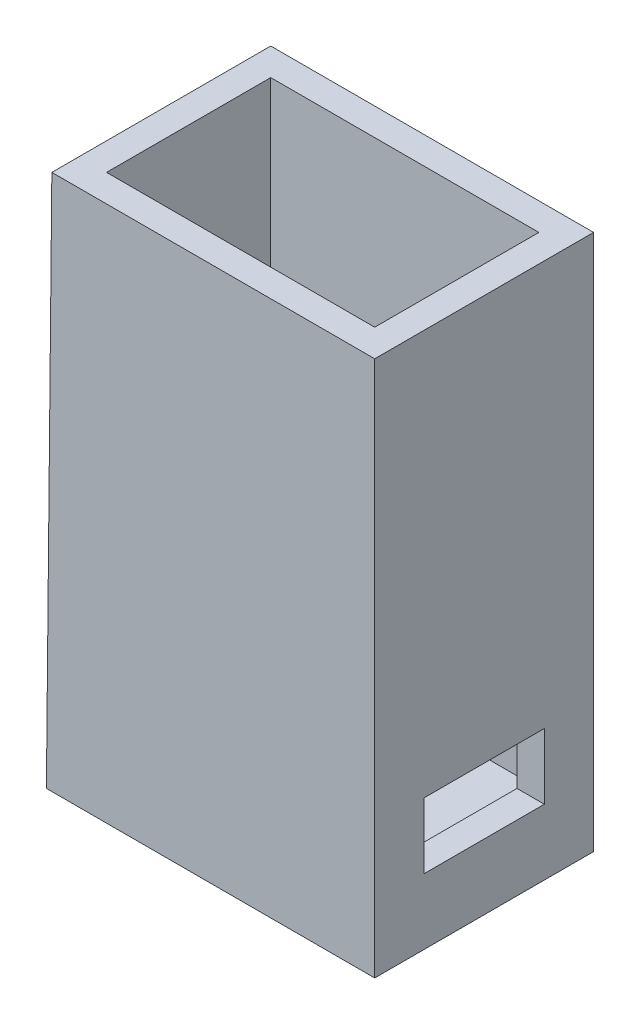
ISO-10303-21;
HEADER;
FILE_DESCRIPTION(('STEP AP214'),'2;1');
FILE_NAME('part.step','',(''),(''),'','','');
FILE_SCHEMA(('AUTOMOTIVE_DESIGN { 1 0 10303 214 1 1 1 1 }'));
ENDSEC;
DATA;
#1=APPLICATION_CONTEXT('core data for automotive mechanical design processes');
#2=APPLICATION_PROTOCOL_DEFINITION('international standard','automotive_design',2000,#1);
#3=PRODUCT_CONTEXT('',#1,'mechanical');
#4=PRODUCT('Part','Part','',(#3));
#5=PRODUCT_RELATED_PRODUCT_CATEGORY('part','',(#4));
#6=PRODUCT_DEFINITION_FORMATION('','',#4);
#7=PRODUCT_DEFINITION_CONTEXT('part definition',#1,'design');
#8=PRODUCT_DEFINITION('design','',#6,#7);
#9=PRODUCT_DEFINITION_SHAPE('','',#8);
#10=(LENGTH_UNIT() NAMED_UNIT(*) SI_UNIT(.MILLI.,.METRE.));
#11=(NAMED_UNIT(*) PLANE_ANGLE_UNIT() SI_UNIT($,.RADIAN.));
#12=(NAMED_UNIT(*) SI_UNIT($,.STERADIAN.) SOLID_ANGLE_UNIT());
#13=UNCERTAINTY_MEASURE_WITH_UNIT(LENGTH_MEASURE(1.E-05),#10,'distance_accuracy_value','');
#14=(GEOMETRIC_REPRESENTATION_CONTEXT(3) GLOBAL_UNCERTAINTY_ASSIGNED_CONTEXT((#13)) GLOBAL_UNIT_ASSIGNED_CONTEXT((#10,
#11,#12)) REPRESENTATION_CONTEXT('',''));
#15=CARTESIAN_POINT('',(0.,0.,0.));
#16=DIRECTION('',(0.,0.,1.));
#17=DIRECTION('',(1.,0.,0.));
#18=AXIS2_PLACEMENT_3D('',#15,#16,#17);
#19=CARTESIAN_POINT('',(34.925,6.34999999999999,25.4));
#20=DIRECTION('',(-1.,0.,0.));
#21=DIRECTION('',(0.,0.,1.));
#22=AXIS2_PLACEMENT_3D('',#19,#20,#21);
#23=PLANE('',#22);
#24=DIRECTION('',(0.,1.,0.));
#25=VECTOR('',#24,1.);
#26=CARTESIAN_POINT('',(34.925,6.34999999999999,19.685));
#27=LINE('',#26,#25);
#28=CARTESIAN_POINT('',(34.925,7.62,19.685));
#29=VERTEX_POINT('',#28);
#30=CARTESIAN_POINT('',(34.925,15.24,19.685));
#31=VERTEX_POINT('',#30);
#32=EDGE_CURVE('E258',#29,#31,#27,.T.);
#33=ORIENTED_EDGE('',*,*,#32,.F.);
#34=DIRECTION('',(0.,0.,1.));
#35=VECTOR('',#34,1.);
#36=CARTESIAN_POINT('',(34.925,7.62,25.4));
#37=LINE('',#36,#35);
#38=CARTESIAN_POINT('',(34.925,7.62,5.715));
#39=VERTEX_POINT('',#38);
#40=EDGE_CURVE('E232',#39,#29,#37,.T.);
#41=ORIENTED_EDGE('',*,*,#40,.F.);
#42=DIRECTION('',(0.,1.,0.));
#43=VECTOR('',#42,1.);
#44=CARTESIAN_POINT('',(34.925,6.35,5.71499999999999));
#45=LINE('',#44,#43);
#46=CARTESIAN_POINT('',(34.925,15.24,5.715));
#47=VERTEX_POINT('',#46);
#48=EDGE_CURVE('E238',#39,#47,#45,.T.);
#49=ORIENTED_EDGE('',*,*,#48,.T.);
#50=DIRECTION('',(0.,0.,1.));
#51=VECTOR('',#50,1.);
#52=CARTESIAN_POINT('',(34.925,15.24,25.4));
#53=LINE('',#52,#51);
#54=EDGE_CURVE('E247',#47,#31,#53,.T.);
#55=ORIENTED_EDGE('',*,*,#54,.T.);
#56=EDGE_LOOP('',(#33,#41,#49,#55));
#57=FACE_BOUND('',#56,.T.);
#58=DIRECTION('',(0.,0.,-1.));
#59=VECTOR('',#58,1.);
#60=CARTESIAN_POINT('',(34.925,62.23,25.4));
#61=LINE('',#60,#59);
#62=CARTESIAN_POINT('',(34.925,62.23,22.225));
#63=VERTEX_POINT('',#62);
#64=CARTESIAN_POINT('',(34.925,62.23,3.175));
#65=VERTEX_POINT('',#64);
#66=EDGE_CURVE('E296',#63,#65,#61,.T.);
#67=ORIENTED_EDGE('',*,*,#66,.T.);
#68=DIRECTION('',(0.,-1.,0.));
#69=VECTOR('',#68,1.);
#70=CARTESIAN_POINT('',(34.925,62.23,3.175));
#71=LINE('',#70,#69);
#72=CARTESIAN_POINT('',(34.925,6.34999999999999,3.175));
#73=VERTEX_POINT('',#72);
#74=EDGE_CURVE('E63',#65,#73,#71,.T.);
#75=ORIENTED_EDGE('',*,*,#74,.T.);
#76=DIRECTION('',(0.,0.,-1.));
#77=VECTOR('',#76,1.);
#78=CARTESIAN_POINT('',(34.925,6.34999999999999,25.4));
#79=LINE('',#78,#77);
#80=CARTESIAN_POINT('',(34.925,6.34999999999999,22.225));
#81=VERTEX_POINT('',#80);
#82=EDGE_CURVE('E168',#81,#73,#79,.T.);
#83=ORIENTED_EDGE('',*,*,#82,.F.);
#84=DIRECTION('',(0.,-1.,0.));
#85=VECTOR('',#84,1.);
#86=CARTESIAN_POINT('',(34.925,62.23,22.225));
#87=LINE('',#86,#85);
#88=EDGE_CURVE('E194',#63,#81,#87,.T.);
#89=ORIENTED_EDGE('',*,*,#88,.F.);
#90=EDGE_LOOP('',(#67,#75,#83,#89));
#91=FACE_BOUND('',#90,.T.);
#92=ADVANCED_FACE('F44',(#57,#91),#23,.T.);
#93=CARTESIAN_POINT('',(3.80714408322846,62.23,25.4));
#94=DIRECTION('',(1.,0.,0.));
#95=DIRECTION('',(0.,1.,0.));
#96=AXIS2_PLACEMENT_3D('',#93,#94,#95);
#97=PLANE('',#96);
#98=DIRECTION('',(0.,-1.,0.));
#99=VECTOR('',#98,1.);
#100=CARTESIAN_POINT('',(3.80714408322847,62.23,3.175));
#101=LINE('',#100,#99);
#102=CARTESIAN_POINT('',(3.80714408322846,62.23,3.175));
#103=VERTEX_POINT('',#102);
#104=CARTESIAN_POINT('',(3.80714408322847,6.34999999999999,3.175));
#105=VERTEX_POINT('',#104);
#106=EDGE_CURVE('E164',#103,#105,#101,.T.);
#107=ORIENTED_EDGE('',*,*,#106,.F.);
#108=DIRECTION('',(0.,0.,-1.));
#109=VECTOR('',#108,1.);
#110=CARTESIAN_POINT('',(3.80714408322846,62.23,25.4));
#111=LINE('',#110,#109);
#112=CARTESIAN_POINT('',(3.80714408322847,62.23,22.225));
#113=VERTEX_POINT('',#112);
#114=EDGE_CURVE('E173',#113,#103,#111,.T.);
#115=ORIENTED_EDGE('',*,*,#114,.F.);
#116=DIRECTION('',(0.,-1.,0.));
#117=VECTOR('',#116,1.);
#118=CARTESIAN_POINT('',(3.80714408322847,62.23,22.225));
#119=LINE('',#118,#117);
#120=CARTESIAN_POINT('',(3.80714408322847,6.34999999999999,22.225));
#121=VERTEX_POINT('',#120);
#122=EDGE_CURVE('E170',#113,#121,#119,.T.);
#123=ORIENTED_EDGE('',*,*,#122,.T.);
#124=DIRECTION('',(0.,0.,-1.));
#125=VECTOR('',#124,1.);
#126=CARTESIAN_POINT('',(3.80714408322847,6.34999999999999,25.4));
#127=LINE('',#126,#125);
#128=EDGE_CURVE('E157',#121,#105,#127,.T.);
#129=ORIENTED_EDGE('',*,*,#128,.T.);
#130=EDGE_LOOP('',(#107,#115,#123,#129));
#131=FACE_BOUND('',#130,.T.);
#132=DIRECTION('',(0.,-1.,0.));
#133=VECTOR('',#132,1.);
#134=CARTESIAN_POINT('',(3.80714408322846,62.23,19.685));
#135=LINE('',#134,#133);
#136=CARTESIAN_POINT('',(3.80714408322847,15.24,19.685));
#137=VERTEX_POINT('',#136);
#138=CARTESIAN_POINT('',(3.80714408322847,7.62,19.685));
#139=VERTEX_POINT('',#138);
#140=EDGE_CURVE('E252',#137,#139,#135,.T.);
#141=ORIENTED_EDGE('',*,*,#140,.F.);
#142=DIRECTION('',(0.,0.,-1.));
#143=VECTOR('',#142,1.);
#144=CARTESIAN_POINT('',(3.80714408322847,15.24,25.4));
#145=LINE('',#144,#143);
#146=CARTESIAN_POINT('',(3.80714408322847,15.24,5.715));
#147=VERTEX_POINT('',#146);
#148=EDGE_CURVE('E244',#137,#147,#145,.T.);
#149=ORIENTED_EDGE('',*,*,#148,.T.);
#150=DIRECTION('',(0.,-1.,0.));
#151=VECTOR('',#150,1.);
#152=CARTESIAN_POINT('',(3.80714408322846,62.23,5.71500000000001));
#153=LINE('',#152,#151);
#154=CARTESIAN_POINT('',(3.80714408322847,7.62,5.71499999999999));
#155=VERTEX_POINT('',#154);
#156=EDGE_CURVE('E237',#147,#155,#153,.T.);
#157=ORIENTED_EDGE('',*,*,#156,.T.);
#158=DIRECTION('',(0.,0.,-1.));
#159=VECTOR('',#158,1.);
#160=CARTESIAN_POINT('',(3.80714408322847,7.62,25.4));
#161=LINE('',#160,#159);
#162=EDGE_CURVE('E227',#139,#155,#161,.T.);
#163=ORIENTED_EDGE('',*,*,#162,.F.);
#164=EDGE_LOOP('',(#141,#149,#157,#163));
#165=FACE_BOUND('',#164,.T.);
#166=ADVANCED_FACE('F161',(#131,#165),#97,.T.);
#167=CARTESIAN_POINT('',(38.1,0.,25.4));
#168=DIRECTION('',(0.,-1.,0.));
#169=DIRECTION('',(1.,0.,0.));
#170=AXIS2_PLACEMENT_3D('',#167,#168,#169);
#171=PLANE('',#170);
#172=DIRECTION('',(-1.,0.,0.));
#173=VECTOR('',#172,1.);
#174=CARTESIAN_POINT('',(38.1,0.,0.));
#175=LINE('',#174,#173);
#176=CARTESIAN_POINT('',(38.1,0.,0.));
#177=VERTEX_POINT('',#176);
#178=CARTESIAN_POINT('',(0.,0.,0.));
#179=VERTEX_POINT('',#178);
#180=EDGE_CURVE('E259',#177,#179,#175,.T.);
#181=ORIENTED_EDGE('',*,*,#180,.F.);
#182=DIRECTION('',(0.,0.,-1.));
#183=VECTOR('',#182,1.);
#184=CARTESIAN_POINT('',(38.1,0.,25.4));
#185=LINE('',#184,#183);
#186=CARTESIAN_POINT('',(38.1,0.,25.4));
#187=VERTEX_POINT('',#186);
#188=EDGE_CURVE('E292',#187,#177,#185,.T.);
#189=ORIENTED_EDGE('',*,*,#188,.F.);
#190=DIRECTION('',(-1.,0.,0.));
#191=VECTOR('',#190,1.);
#192=CARTESIAN_POINT('',(38.1,0.,25.4));
#193=LINE('',#192,#191);
#194=CARTESIAN_POINT('',(0.,0.,25.4));
#195=VERTEX_POINT('',#194);
#196=EDGE_CURVE('E257',#187,#195,#193,.T.);
#197=ORIENTED_EDGE('',*,*,#196,.T.);
#198=DIRECTION('',(0.,0.,-1.));
#199=VECTOR('',#198,1.);
#200=CARTESIAN_POINT('',(0.,0.,25.4));
#201=LINE('',#200,#199);
#202=EDGE_CURVE('E277',#195,#179,#201,.T.);
#203=ORIENTED_EDGE('',*,*,#202,.T.);
#204=EDGE_LOOP('',(#181,#189,#197,#203));
#205=FACE_BOUND('',#204,.T.);
#206=ADVANCED_FACE('F50',(#205),#171,.T.);
#207=CARTESIAN_POINT('',(38.1,62.23,25.4));
#208=DIRECTION('',(1.,0.,0.));
#209=DIRECTION('',(0.,1.,0.));
#210=AXIS2_PLACEMENT_3D('',#207,#208,#209);
#211=PLANE('',#210);
#212=DIRECTION('',(0.,-1.,0.));
#213=VECTOR('',#212,1.);
#214=CARTESIAN_POINT('',(38.1,15.24,19.685));
#215=LINE('',#214,#213);
#216=CARTESIAN_POINT('',(38.1,15.24,19.685));
#217=VERTEX_POINT('',#216);
#218=CARTESIAN_POINT('',(38.1,7.62,19.685));
#219=VERTEX_POINT('',#218);
#220=EDGE_CURVE('E184',#217,#219,#215,.T.);
#221=ORIENTED_EDGE('',*,*,#220,.F.);
#222=DIRECTION('',(0.,0.,-1.));
#223=VECTOR('',#222,1.);
#224=CARTESIAN_POINT('',(38.1,15.24,19.685));
#225=LINE('',#224,#223);
#226=CARTESIAN_POINT('',(38.1,15.24,5.715));
#227=VERTEX_POINT('',#226);
#228=EDGE_CURVE('E207',#217,#227,#225,.T.);
#229=ORIENTED_EDGE('',*,*,#228,.T.);
#230=DIRECTION('',(0.,-1.,0.));
#231=VECTOR('',#230,1.);
#232=CARTESIAN_POINT('',(38.1,15.24,5.715));
#233=LINE('',#232,#231);
#234=CARTESIAN_POINT('',(38.1,7.62,5.71499999999999));
#235=VERTEX_POINT('',#234);
#236=EDGE_CURVE('E202',#227,#235,#233,.T.);
#237=ORIENTED_EDGE('',*,*,#236,.T.);
#238=DIRECTION('',(0.,0.,-1.));
#239=VECTOR('',#238,1.);
#240=CARTESIAN_POINT('',(38.1,7.62,19.685));
#241=LINE('',#240,#239);
#242=EDGE_CURVE('E186',#219,#235,#241,.T.);
#243=ORIENTED_EDGE('',*,*,#242,.F.);
#244=EDGE_LOOP('',(#221,#229,#237,#243));
#245=FACE_BOUND('',#244,.T.);
#246=DIRECTION('',(0.,-1.,0.));
#247=VECTOR('',#246,1.);
#248=CARTESIAN_POINT('',(38.1,62.23,0.));
#249=LINE('',#248,#247);
#250=CARTESIAN_POINT('',(38.1,62.23,0.));
#251=VERTEX_POINT('',#250);
#252=EDGE_CURVE('E264',#251,#177,#249,.T.);
#253=ORIENTED_EDGE('',*,*,#252,.F.);
#254=DIRECTION('',(0.,0.,-1.));
#255=VECTOR('',#254,1.);
#256=CARTESIAN_POINT('',(38.1,62.23,25.4));
#257=LINE('',#256,#255);
#258=CARTESIAN_POINT('',(38.1,62.23,25.4));
#259=VERTEX_POINT('',#258);
#260=EDGE_CURVE('E293',#259,#251,#257,.T.);
#261=ORIENTED_EDGE('',*,*,#260,.F.);
#262=DIRECTION('',(0.,-1.,0.));
#263=VECTOR('',#262,1.);
#264=CARTESIAN_POINT('',(38.1,62.23,25.4));
#265=LINE('',#264,#263);
#266=EDGE_CURVE('E275',#259,#187,#265,.T.);
#267=ORIENTED_EDGE('',*,*,#266,.T.);
#268=ORIENTED_EDGE('',*,*,#188,.T.);
#269=EDGE_LOOP('',(#253,#261,#267,#268));
#270=FACE_BOUND('',#269,.T.);
#271=ADVANCED_FACE('F353',(#245,#270),#211,.T.);
#272=CARTESIAN_POINT('',(34.925,62.23,25.4));
#273=DIRECTION('',(0.,1.,0.));
#274=DIRECTION('',(0.,0.,1.));
#275=AXIS2_PLACEMENT_3D('',#272,#273,#274);
#276=PLANE('',#275);
#277=DIRECTION('',(1.,0.,0.));
#278=VECTOR('',#277,1.);
#279=CARTESIAN_POINT('',(34.925,62.23,0.));
#280=LINE('',#279,#278);
#281=CARTESIAN_POINT('',(0.632144083228461,62.23,0.));
#282=VERTEX_POINT('',#281);
#283=EDGE_CURVE('E284',#282,#251,#280,.T.);
#284=ORIENTED_EDGE('',*,*,#283,.F.);
#285=DIRECTION('',(0.,0.,-1.));
#286=VECTOR('',#285,1.);
#287=CARTESIAN_POINT('',(0.632144083228461,62.23,25.4));
#288=LINE('',#287,#286);
#289=CARTESIAN_POINT('',(0.632144083228461,62.23,25.4));
#290=VERTEX_POINT('',#289);
#291=EDGE_CURVE('E301',#290,#282,#288,.T.);
#292=ORIENTED_EDGE('',*,*,#291,.F.);
#293=DIRECTION('',(1.,0.,0.));
#294=VECTOR('',#293,1.);
#295=CARTESIAN_POINT('',(0.632144083228461,62.23,25.4));
#296=LINE('',#295,#294);
#297=EDGE_CURVE('E267',#290,#259,#296,.T.);
#298=ORIENTED_EDGE('',*,*,#297,.T.);
#299=ORIENTED_EDGE('',*,*,#260,.T.);
#300=EDGE_LOOP('',(#284,#292,#298,#299));
#301=FACE_BOUND('',#300,.T.);
#302=DIRECTION('',(1.,0.,0.));
#303=VECTOR('',#302,1.);
#304=CARTESIAN_POINT('',(3.80714408322847,62.23,3.175));
#305=LINE('',#304,#303);
#306=EDGE_CURVE('E177',#103,#65,#305,.T.);
#307=ORIENTED_EDGE('',*,*,#306,.T.);
#308=ORIENTED_EDGE('',*,*,#66,.F.);
#309=DIRECTION('',(-1.,0.,0.));
#310=VECTOR('',#309,1.);
#311=CARTESIAN_POINT('',(3.80714408322847,62.23,22.225));
#312=LINE('',#311,#310);
#313=EDGE_CURVE('E197',#63,#113,#312,.T.);
#314=ORIENTED_EDGE('',*,*,#313,.T.);
#315=ORIENTED_EDGE('',*,*,#114,.T.);
#316=EDGE_LOOP('',(#307,#308,#314,#315));
#317=FACE_BOUND('',#316,.T.);
#318=ADVANCED_FACE('F370',(#301,#317),#276,.T.);
#319=CARTESIAN_POINT('',(3.80714408322847,6.34999999999999,25.4));
#320=DIRECTION('',(0.,1.,0.));
#321=DIRECTION('',(0.,0.,1.));
#322=AXIS2_PLACEMENT_3D('',#319,#320,#321);
#323=PLANE('',#322);
#324=DIRECTION('',(1.,0.,0.));
#325=VECTOR('',#324,1.);
#326=CARTESIAN_POINT('',(3.80714408322847,6.34999999999999,3.175));
#327=LINE('',#326,#325);
#328=EDGE_CURVE('E174',#105,#73,#327,.T.);
#329=ORIENTED_EDGE('',*,*,#328,.F.);
#330=ORIENTED_EDGE('',*,*,#128,.F.);
#331=DIRECTION('',(-1.,0.,0.));
#332=VECTOR('',#331,1.);
#333=CARTESIAN_POINT('',(3.80714408322847,6.34999999999999,22.225));
#334=LINE('',#333,#332);
#335=EDGE_CURVE('E70',#81,#121,#334,.T.);
#336=ORIENTED_EDGE('',*,*,#335,.F.);
#337=ORIENTED_EDGE('',*,*,#82,.T.);
#338=EDGE_LOOP('',(#329,#330,#336,#337));
#339=FACE_BOUND('',#338,.T.);
#340=ADVANCED_FACE('F172',(#339),#323,.T.);
#341=CARTESIAN_POINT('',(0.,0.,25.4));
#342=DIRECTION('',(-0.999948409593727,0.0101576646417867,0.));
#343=DIRECTION('',(-0.0101576646417867,-0.999948409593728,0.));
#344=AXIS2_PLACEMENT_3D('',#341,#342,#343);
#345=PLANE('',#344);
#346=DIRECTION('',(0.0101576646417867,0.999948409593728,0.));
#347=VECTOR('',#346,1.);
#348=CARTESIAN_POINT('',(0.,0.,19.685));
#349=LINE('',#348,#347);
#350=CARTESIAN_POINT('',(0.0774053979463422,7.62,19.685));
#351=VERTEX_POINT('',#350);
#352=CARTESIAN_POINT('',(0.154810795892684,15.24,19.685));
#353=VERTEX_POINT('',#352);
#354=EDGE_CURVE('E11',#351,#353,#349,.T.);
#355=ORIENTED_EDGE('',*,*,#354,.F.);
#356=DIRECTION('',(0.,0.,1.));
#357=VECTOR('',#356,1.);
#358=CARTESIAN_POINT('',(0.0774053979463422,7.62,25.4));
#359=LINE('',#358,#357);
#360=CARTESIAN_POINT('',(0.0774053979463422,7.62,5.715));
#361=VERTEX_POINT('',#360);
#362=EDGE_CURVE('E294',#361,#351,#359,.T.);
#363=ORIENTED_EDGE('',*,*,#362,.F.);
#364=DIRECTION('',(0.0101576646417867,0.999948409593728,0.));
#365=VECTOR('',#364,1.);
#366=CARTESIAN_POINT('',(0.,0.,5.71499999999999));
#367=LINE('',#366,#365);
#368=CARTESIAN_POINT('',(0.154810795892684,15.24,5.715));
#369=VERTEX_POINT('',#368);
#370=EDGE_CURVE('E311',#361,#369,#367,.T.);
#371=ORIENTED_EDGE('',*,*,#370,.T.);
#372=DIRECTION('',(0.,0.,1.));
#373=VECTOR('',#372,1.);
#374=CARTESIAN_POINT('',(0.154810795892684,15.24,25.4));
#375=LINE('',#374,#373);
#376=EDGE_CURVE('E53',#369,#353,#375,.T.);
#377=ORIENTED_EDGE('',*,*,#376,.T.);
#378=EDGE_LOOP('',(#355,#363,#371,#377));
#379=FACE_BOUND('',#378,.T.);
#380=DIRECTION('',(0.0101576646417867,0.999948409593727,0.));
#381=VECTOR('',#380,1.);
#382=CARTESIAN_POINT('',(0.,0.,0.));
#383=LINE('',#382,#381);
#384=EDGE_CURVE('E278',#179,#282,#383,.T.);
#385=ORIENTED_EDGE('',*,*,#384,.F.);
#386=ORIENTED_EDGE('',*,*,#202,.F.);
#387=DIRECTION('',(0.0101576646417867,0.999948409593727,0.));
#388=VECTOR('',#387,1.);
#389=CARTESIAN_POINT('',(0.,0.,25.4));
#390=LINE('',#389,#388);
#391=EDGE_CURVE('E262',#195,#290,#390,.T.);
#392=ORIENTED_EDGE('',*,*,#391,.T.);
#393=ORIENTED_EDGE('',*,*,#291,.T.);
#394=EDGE_LOOP('',(#385,#386,#392,#393));
#395=FACE_BOUND('',#394,.T.);
#396=ADVANCED_FACE('F319',(#379,#395),#345,.T.);
#397=CARTESIAN_POINT('',(0.,0.,25.4));
#398=DIRECTION('',(0.,0.,1.));
#399=DIRECTION('',(1.,0.,0.));
#400=AXIS2_PLACEMENT_3D('',#397,#398,#399);
#401=PLANE('',#400);
#402=ORIENTED_EDGE('',*,*,#266,.F.);
#403=ORIENTED_EDGE('',*,*,#297,.F.);
#404=ORIENTED_EDGE('',*,*,#391,.F.);
#405=ORIENTED_EDGE('',*,*,#196,.F.);
#406=EDGE_LOOP('',(#402,#403,#404,#405));
#407=FACE_BOUND('',#406,.T.);
#408=ADVANCED_FACE('F359',(#407),#401,.T.);
#409=CARTESIAN_POINT('',(0.,0.,0.));
#410=DIRECTION('',(0.,0.,1.));
#411=DIRECTION('',(1.,0.,0.));
#412=AXIS2_PLACEMENT_3D('',#409,#410,#411);
#413=PLANE('',#412);
#414=ORIENTED_EDGE('',*,*,#384,.T.);
#415=ORIENTED_EDGE('',*,*,#283,.T.);
#416=ORIENTED_EDGE('',*,*,#252,.T.);
#417=ORIENTED_EDGE('',*,*,#180,.T.);
#418=EDGE_LOOP('',(#414,#415,#416,#417));
#419=FACE_BOUND('',#418,.T.);
#420=ADVANCED_FACE('F361',(#419),#413,.F.);
#421=CARTESIAN_POINT('',(0.,7.62,19.685));
#422=DIRECTION('',(0.,-1.,0.));
#423=DIRECTION('',(0.,0.,-1.));
#424=AXIS2_PLACEMENT_3D('',#421,#422,#423);
#425=PLANE('',#424);
#426=ORIENTED_EDGE('',*,*,#162,.T.);
#427=DIRECTION('',(1.,0.,0.));
#428=VECTOR('',#427,1.);
#429=CARTESIAN_POINT('',(0.,7.62,5.71499999999999));
#430=LINE('',#429,#428);
#431=EDGE_CURVE('E225',#361,#155,#430,.T.);
#432=ORIENTED_EDGE('',*,*,#431,.F.);
#433=ORIENTED_EDGE('',*,*,#362,.T.);
#434=DIRECTION('',(1.,0.,0.));
#435=VECTOR('',#434,1.);
#436=CARTESIAN_POINT('',(0.,7.62,19.685));
#437=LINE('',#436,#435);
#438=EDGE_CURVE('E228',#351,#139,#437,.T.);
#439=ORIENTED_EDGE('',*,*,#438,.T.);
#440=EDGE_LOOP('',(#426,#432,#433,#439));
#441=FACE_BOUND('',#440,.T.);
#442=ADVANCED_FACE('F339',(#441),#425,.F.);
#443=CARTESIAN_POINT('',(0.,15.24,5.715));
#444=DIRECTION('',(0.,0.,1.));
#445=DIRECTION('',(0.,-1.,0.));
#446=AXIS2_PLACEMENT_3D('',#443,#444,#445);
#447=PLANE('',#446);
#448=DIRECTION('',(1.,0.,0.));
#449=VECTOR('',#448,1.);
#450=CARTESIAN_POINT('',(0.,15.24,5.715));
#451=LINE('',#450,#449);
#452=EDGE_CURVE('E217',#369,#147,#451,.T.);
#453=ORIENTED_EDGE('',*,*,#452,.F.);
#454=ORIENTED_EDGE('',*,*,#370,.F.);
#455=ORIENTED_EDGE('',*,*,#431,.T.);
#456=ORIENTED_EDGE('',*,*,#156,.F.);
#457=EDGE_LOOP('',(#453,#454,#455,#456));
#458=FACE_BOUND('',#457,.T.);
#459=ADVANCED_FACE('F332',(#458),#447,.T.);
#460=CARTESIAN_POINT('',(0.,15.24,19.685));
#461=DIRECTION('',(0.,-1.,0.));
#462=DIRECTION('',(0.,0.,-1.));
#463=AXIS2_PLACEMENT_3D('',#460,#461,#462);
#464=PLANE('',#463);
#465=DIRECTION('',(1.,0.,0.));
#466=VECTOR('',#465,1.);
#467=CARTESIAN_POINT('',(0.,15.24,19.685));
#468=LINE('',#467,#466);
#469=EDGE_CURVE('E220',#353,#137,#468,.T.);
#470=ORIENTED_EDGE('',*,*,#469,.F.);
#471=ORIENTED_EDGE('',*,*,#376,.F.);
#472=ORIENTED_EDGE('',*,*,#452,.T.);
#473=ORIENTED_EDGE('',*,*,#148,.F.);
#474=EDGE_LOOP('',(#470,#471,#472,#473));
#475=FACE_BOUND('',#474,.T.);
#476=ADVANCED_FACE('F327',(#475),#464,.T.);
#477=CARTESIAN_POINT('',(0.,15.24,19.685));
#478=DIRECTION('',(0.,0.,1.));
#479=DIRECTION('',(0.,-1.,0.));
#480=AXIS2_PLACEMENT_3D('',#477,#478,#479);
#481=PLANE('',#480);
#482=ORIENTED_EDGE('',*,*,#140,.T.);
#483=ORIENTED_EDGE('',*,*,#438,.F.);
#484=ORIENTED_EDGE('',*,*,#354,.T.);
#485=ORIENTED_EDGE('',*,*,#469,.T.);
#486=EDGE_LOOP('',(#482,#483,#484,#485));
#487=FACE_BOUND('',#486,.T.);
#488=ADVANCED_FACE('F342',(#487),#481,.F.);
#489=ORIENTED_EDGE('',*,*,#32,.T.);
#490=EDGE_CURVE('E212',#31,#217,#468,.T.);
#491=ORIENTED_EDGE('',*,*,#490,.T.);
#492=ORIENTED_EDGE('',*,*,#220,.T.);
#493=EDGE_CURVE('E213',#29,#219,#437,.T.);
#494=ORIENTED_EDGE('',*,*,#493,.F.);
#495=EDGE_LOOP('',(#489,#491,#492,#494));
#496=FACE_BOUND('',#495,.T.);
#497=ADVANCED_FACE('F382',(#496),#481,.F.);
#498=EDGE_CURVE('E218',#47,#227,#451,.T.);
#499=ORIENTED_EDGE('',*,*,#498,.T.);
#500=ORIENTED_EDGE('',*,*,#228,.F.);
#501=ORIENTED_EDGE('',*,*,#490,.F.);
#502=ORIENTED_EDGE('',*,*,#54,.F.);
#503=EDGE_LOOP('',(#499,#500,#501,#502));
#504=FACE_BOUND('',#503,.T.);
#505=ADVANCED_FACE('F393',(#504),#464,.T.);
#506=EDGE_CURVE('E224',#39,#235,#430,.T.);
#507=ORIENTED_EDGE('',*,*,#506,.T.);
#508=ORIENTED_EDGE('',*,*,#236,.F.);
#509=ORIENTED_EDGE('',*,*,#498,.F.);
#510=ORIENTED_EDGE('',*,*,#48,.F.);
#511=EDGE_LOOP('',(#507,#508,#509,#510));
#512=FACE_BOUND('',#511,.T.);
#513=ADVANCED_FACE('F389',(#512),#447,.T.);
#514=ORIENTED_EDGE('',*,*,#40,.T.);
#515=ORIENTED_EDGE('',*,*,#493,.T.);
#516=ORIENTED_EDGE('',*,*,#242,.T.);
#517=ORIENTED_EDGE('',*,*,#506,.F.);
#518=EDGE_LOOP('',(#514,#515,#516,#517));
#519=FACE_BOUND('',#518,.T.);
#520=ADVANCED_FACE('F384',(#519),#425,.F.);
#521=CARTESIAN_POINT('',(3.80714408322847,62.23,22.225));
#522=DIRECTION('',(0.,0.,1.));
#523=DIRECTION('',(1.,0.,0.));
#524=AXIS2_PLACEMENT_3D('',#521,#522,#523);
#525=PLANE('',#524);
#526=ORIENTED_EDGE('',*,*,#335,.T.);
#527=ORIENTED_EDGE('',*,*,#122,.F.);
#528=ORIENTED_EDGE('',*,*,#313,.F.);
#529=ORIENTED_EDGE('',*,*,#88,.T.);
#530=EDGE_LOOP('',(#526,#527,#528,#529));
#531=FACE_BOUND('',#530,.T.);
#532=ADVANCED_FACE('F395',(#531),#525,.F.);
#533=CARTESIAN_POINT('',(3.80714408322847,62.23,3.175));
#534=DIRECTION('',(0.,0.,-1.));
#535=DIRECTION('',(-1.,0.,0.));
#536=AXIS2_PLACEMENT_3D('',#533,#534,#535);
#537=PLANE('',#536);
#538=ORIENTED_EDGE('',*,*,#328,.T.);
#539=ORIENTED_EDGE('',*,*,#74,.F.);
#540=ORIENTED_EDGE('',*,*,#306,.F.);
#541=ORIENTED_EDGE('',*,*,#106,.T.);
#542=EDGE_LOOP('',(#538,#539,#540,#541));
#543=FACE_BOUND('',#542,.T.);
#544=ADVANCED_FACE('F182',(#543),#537,.F.);
#545=CLOSED_SHELL('',(#92,#166,#206,#271,#318,#340,#396,#408,#420,#442,#459,#476,#488,#497,#505,
#513,#520,#532,#544));
#546=MANIFOLD_SOLID_BREP('B2',#545);
#547=ADVANCED_BREP_SHAPE_REPRESENTATION('',(#18,#546),#14);
#548=SHAPE_DEFINITION_REPRESENTATION(#9,#547);
ENDSEC;
END-ISO-10303-21;
